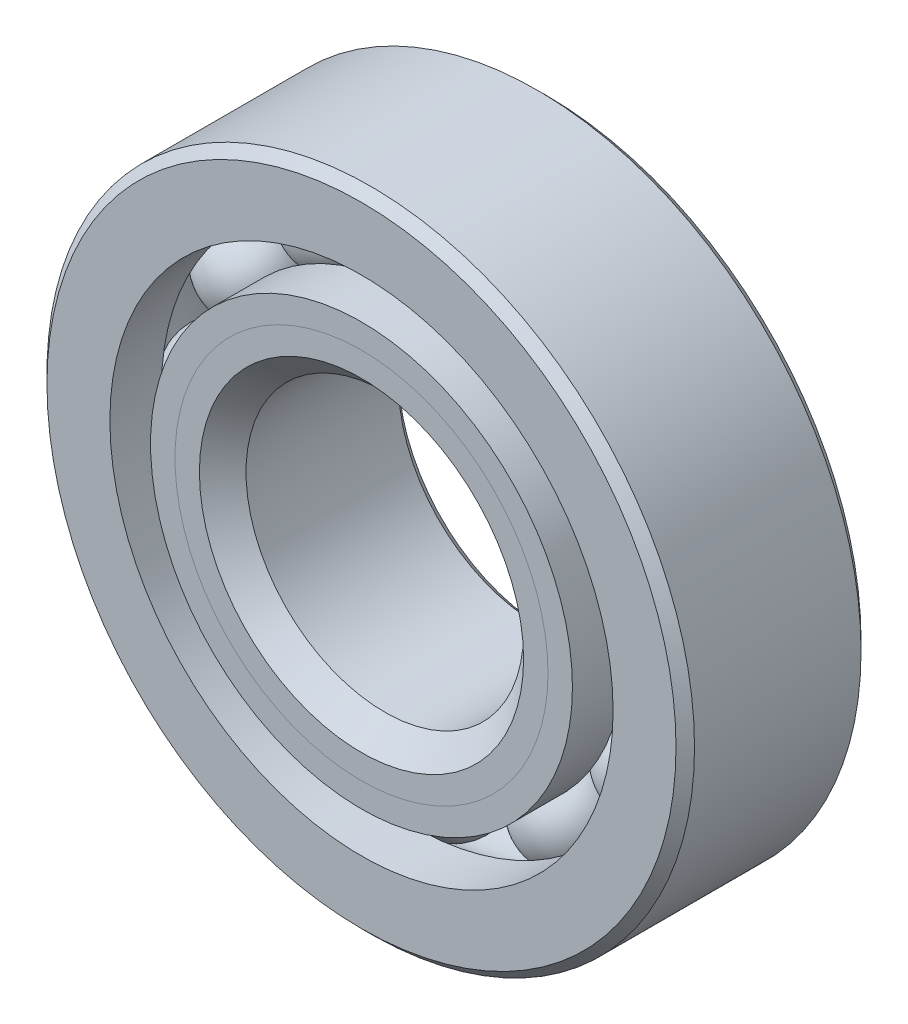
ISO-10303-21;
HEADER;
FILE_DESCRIPTION(('STEP AP214'),'2;1');
FILE_NAME('part.step','',(''),(''),'','','');
FILE_SCHEMA(('AUTOMOTIVE_DESIGN { 1 0 10303 214 1 1 1 1 }'));
ENDSEC;
DATA;
#1=APPLICATION_CONTEXT('core data for automotive mechanical design processes');
#2=APPLICATION_PROTOCOL_DEFINITION('international standard','automotive_design',2000,#1);
#3=PRODUCT_CONTEXT('',#1,'mechanical');
#4=PRODUCT('Part','Part','',(#3));
#5=PRODUCT_RELATED_PRODUCT_CATEGORY('part','',(#4));
#6=PRODUCT_DEFINITION_FORMATION('','',#4);
#7=PRODUCT_DEFINITION_CONTEXT('part definition',#1,'design');
#8=PRODUCT_DEFINITION('design','',#6,#7);
#9=PRODUCT_DEFINITION_SHAPE('','',#8);
#10=(LENGTH_UNIT() NAMED_UNIT(*) SI_UNIT(.MILLI.,.METRE.));
#11=(NAMED_UNIT(*) PLANE_ANGLE_UNIT() SI_UNIT($,.RADIAN.));
#12=(NAMED_UNIT(*) SI_UNIT($,.STERADIAN.) SOLID_ANGLE_UNIT());
#13=UNCERTAINTY_MEASURE_WITH_UNIT(LENGTH_MEASURE(1.E-05),#10,'distance_accuracy_value','');
#14=(GEOMETRIC_REPRESENTATION_CONTEXT(3) GLOBAL_UNCERTAINTY_ASSIGNED_CONTEXT((#13)) GLOBAL_UNIT_ASSIGNED_CONTEXT((#10,
#11,#12)) REPRESENTATION_CONTEXT('',''));
#15=CARTESIAN_POINT('',(0.,0.,0.));
#16=DIRECTION('',(0.,0.,1.));
#17=DIRECTION('',(1.,0.,0.));
#18=AXIS2_PLACEMENT_3D('',#15,#16,#17);
#19=CARTESIAN_POINT('',(-4.99999999999989,8.66025403784445,0.));
#20=DIRECTION('',(0.,0.,1.));
#21=DIRECTION('',(-0.499999999999989,0.866025403784445,0.));
#22=AXIS2_PLACEMENT_3D('',#19,#20,#21);
#23=SPHERICAL_SURFACE('',#22,1.9832668371318);
#24=CARTESIAN_POINT('',(-4.99999999999989,8.66025403784445,1.9832668371318));
#25=VERTEX_POINT('',#24);
#26=VERTEX_LOOP('',#25);
#27=FACE_BOUND('',#26,.T.);
#28=ADVANCED_FACE('F42',(#27),#23,.T.);
#29=CLOSED_SHELL('',(#28));
#30=MANIFOLD_SOLID_BREP('B2',#29);
#31=CARTESIAN_POINT('',(-8.66025403784433,5.0000000000001,0.));
#32=DIRECTION('',(0.,0.,1.));
#33=DIRECTION('',(-0.866025403784433,0.50000000000001,0.));
#34=AXIS2_PLACEMENT_3D('',#31,#32,#33);
#35=SPHERICAL_SURFACE('',#34,1.9832668371318);
#36=CARTESIAN_POINT('',(-8.66025403784433,5.0000000000001,1.9832668371318));
#37=VERTEX_POINT('',#36);
#38=VERTEX_LOOP('',#37);
#39=FACE_BOUND('',#38,.T.);
#40=ADVANCED_FACE('F75',(#39),#35,.T.);
#41=CLOSED_SHELL('',(#40));
#42=MANIFOLD_SOLID_BREP('B6',#41);
#43=CARTESIAN_POINT('',(-10.,1.04744440165294E-13,0.));
#44=DIRECTION('',(0.,0.,1.));
#45=DIRECTION('',(-1.,0.,0.));
#46=AXIS2_PLACEMENT_3D('',#43,#44,#45);
#47=SPHERICAL_SURFACE('',#46,1.9832668371318);
#48=CARTESIAN_POINT('',(-10.,1.04744440165294E-13,1.9832668371318));
#49=VERTEX_POINT('',#48);
#50=VERTEX_LOOP('',#49);
#51=FACE_BOUND('',#50,.T.);
#52=ADVANCED_FACE('F108',(#51),#47,.T.);
#53=CLOSED_SHELL('',(#52));
#54=MANIFOLD_SOLID_BREP('B38',#53);
#55=CARTESIAN_POINT('',(-8.66025403784443,-4.99999999999992,0.));
#56=DIRECTION('',(0.,0.,1.));
#57=DIRECTION('',(-0.866025403784443,-0.499999999999992,0.));
#58=AXIS2_PLACEMENT_3D('',#55,#56,#57);
#59=SPHERICAL_SURFACE('',#58,1.9832668371318);
#60=CARTESIAN_POINT('',(-8.66025403784443,-4.99999999999992,1.9832668371318));
#61=VERTEX_POINT('',#60);
#62=VERTEX_LOOP('',#61);
#63=FACE_BOUND('',#62,.T.);
#64=ADVANCED_FACE('F141',(#63),#59,.T.);
#65=CLOSED_SHELL('',(#64));
#66=MANIFOLD_SOLID_BREP('B71',#65);
#67=CARTESIAN_POINT('',(-5.00000000000007,-8.66025403784435,0.));
#68=DIRECTION('',(0.,0.,1.));
#69=DIRECTION('',(-0.500000000000007,-0.866025403784435,0.));
#70=AXIS2_PLACEMENT_3D('',#67,#68,#69);
#71=SPHERICAL_SURFACE('',#70,1.9832668371318);
#72=CARTESIAN_POINT('',(-5.00000000000007,-8.66025403784435,1.9832668371318));
#73=VERTEX_POINT('',#72);
#74=VERTEX_LOOP('',#73);
#75=FACE_BOUND('',#74,.T.);
#76=ADVANCED_FACE('F174',(#75),#71,.T.);
#77=CLOSED_SHELL('',(#76));
#78=MANIFOLD_SOLID_BREP('B104',#77);
#79=CARTESIAN_POINT('',(0.,-10.,0.));
#80=DIRECTION('',(0.,0.,1.));
#81=DIRECTION('',(0.,-1.,0.));
#82=AXIS2_PLACEMENT_3D('',#79,#80,#81);
#83=SPHERICAL_SURFACE('',#82,1.9832668371318);
#84=CARTESIAN_POINT('',(0.,-10.,1.9832668371318));
#85=VERTEX_POINT('',#84);
#86=VERTEX_LOOP('',#85);
#87=FACE_BOUND('',#86,.T.);
#88=ADVANCED_FACE('F207',(#87),#83,.T.);
#89=CLOSED_SHELL('',(#88));
#90=MANIFOLD_SOLID_BREP('B137',#89);
#91=CARTESIAN_POINT('',(4.99999999999995,-8.66025403784442,0.));
#92=DIRECTION('',(0.,0.,1.));
#93=DIRECTION('',(0.499999999999995,-0.866025403784442,0.));
#94=AXIS2_PLACEMENT_3D('',#91,#92,#93);
#95=SPHERICAL_SURFACE('',#94,1.9832668371318);
#96=CARTESIAN_POINT('',(4.99999999999995,-8.66025403784442,1.9832668371318));
#97=VERTEX_POINT('',#96);
#98=VERTEX_LOOP('',#97);
#99=FACE_BOUND('',#98,.T.);
#100=ADVANCED_FACE('F240',(#99),#95,.T.);
#101=CLOSED_SHELL('',(#100));
#102=MANIFOLD_SOLID_BREP('B170',#101);
#103=CARTESIAN_POINT('',(8.66025403784437,-5.00000000000004,0.));
#104=DIRECTION('',(0.,0.,1.));
#105=DIRECTION('',(0.866025403784436,-0.500000000000004,0.));
#106=AXIS2_PLACEMENT_3D('',#103,#104,#105);
#107=SPHERICAL_SURFACE('',#106,1.9832668371318);
#108=CARTESIAN_POINT('',(8.66025403784437,-5.00000000000004,1.9832668371318));
#109=VERTEX_POINT('',#108);
#110=VERTEX_LOOP('',#109);
#111=FACE_BOUND('',#110,.T.);
#112=ADVANCED_FACE('F275',(#111),#107,.T.);
#113=CLOSED_SHELL('',(#112));
#114=MANIFOLD_SOLID_BREP('B203',#113);
#115=CARTESIAN_POINT('',(10.,0.,0.));
#116=DIRECTION('',(0.,0.,1.));
#117=DIRECTION('',(1.,0.,0.));
#118=AXIS2_PLACEMENT_3D('',#115,#116,#117);
#119=SPHERICAL_SURFACE('',#118,1.9832668371318);
#120=CARTESIAN_POINT('',(10.,0.,1.9832668371318));
#121=VERTEX_POINT('',#120);
#122=VERTEX_LOOP('',#121);
#123=FACE_BOUND('',#122,.T.);
#124=ADVANCED_FACE('F310',(#123),#119,.T.);
#125=CLOSED_SHELL('',(#124));
#126=MANIFOLD_SOLID_BREP('B236',#125);
#127=CARTESIAN_POINT('',(8.6602540378444,4.99999999999998,0.));
#128=DIRECTION('',(0.,0.,1.));
#129=DIRECTION('',(0.86602540378444,0.499999999999998,0.));
#130=AXIS2_PLACEMENT_3D('',#127,#128,#129);
#131=SPHERICAL_SURFACE('',#130,1.9832668371318);
#132=CARTESIAN_POINT('',(8.6602540378444,4.99999999999998,1.9832668371318));
#133=VERTEX_POINT('',#132);
#134=VERTEX_LOOP('',#133);
#135=FACE_BOUND('',#134,.T.);
#136=ADVANCED_FACE('F345',(#135),#131,.T.);
#137=CLOSED_SHELL('',(#136));
#138=MANIFOLD_SOLID_BREP('B271',#137);
#139=CARTESIAN_POINT('',(5.00000000000001,8.66025403784438,0.));
#140=DIRECTION('',(0.,0.,1.));
#141=DIRECTION('',(0.500000000000001,0.866025403784438,0.));
#142=AXIS2_PLACEMENT_3D('',#139,#140,#141);
#143=SPHERICAL_SURFACE('',#142,1.9832668371318);
#144=CARTESIAN_POINT('',(5.00000000000001,8.66025403784438,1.9832668371318));
#145=VERTEX_POINT('',#144);
#146=VERTEX_LOOP('',#145);
#147=FACE_BOUND('',#146,.T.);
#148=ADVANCED_FACE('F378',(#147),#143,.T.);
#149=CLOSED_SHELL('',(#148));
#150=MANIFOLD_SOLID_BREP('B306',#149);
#151=CARTESIAN_POINT('',(0.,10.,0.));
#152=DIRECTION('',(0.,0.,1.));
#153=DIRECTION('',(0.,1.,0.));
#154=AXIS2_PLACEMENT_3D('',#151,#152,#153);
#155=SPHERICAL_SURFACE('',#154,1.9832668371318);
#156=CARTESIAN_POINT('',(0.,10.,1.9832668371318));
#157=VERTEX_POINT('',#156);
#158=VERTEX_LOOP('',#157);
#159=FACE_BOUND('',#158,.T.);
#160=ADVANCED_FACE('F415',(#159),#155,.T.);
#161=CLOSED_SHELL('',(#160));
#162=MANIFOLD_SOLID_BREP('B341',#161);
#163=CARTESIAN_POINT('',(0.,8.06462285115661,4.));
#164=DIRECTION('',(0.,0.,-1.));
#165=DIRECTION('',(-1.,0.,0.));
#166=AXIS2_PLACEMENT_3D('',#163,#164,#165);
#167=PLANE('',#166);
#168=CARTESIAN_POINT('',(0.,0.,4.));
#169=DIRECTION('',(0.,0.,1.));
#170=DIRECTION('',(1.,0.,0.));
#171=AXIS2_PLACEMENT_3D('',#168,#169,#170);
#172=CIRCLE('',#171,7.0083665814341);
#173=CARTESIAN_POINT('',(7.0083665814341,0.,4.));
#174=VERTEX_POINT('',#173);
#175=EDGE_CURVE('E468',#174,#174,#172,.T.);
#176=ORIENTED_EDGE('',*,*,#175,.F.);
#177=EDGE_LOOP('',(#176));
#178=FACE_BOUND('',#177,.T.);
#179=CARTESIAN_POINT('',(0.,0.,4.));
#180=DIRECTION('',(0.,0.,1.));
#181=DIRECTION('',(1.,0.,0.));
#182=AXIS2_PLACEMENT_3D('',#179,#180,#181);
#183=CIRCLE('',#182,8.06462285115661);
#184=CARTESIAN_POINT('',(8.06462285115661,0.,4.));
#185=VERTEX_POINT('',#184);
#186=EDGE_CURVE('E414',#185,#185,#183,.T.);
#187=ORIENTED_EDGE('',*,*,#186,.T.);
#188=EDGE_LOOP('',(#187));
#189=FACE_BOUND('',#188,.T.);
#190=ADVANCED_FACE('F434',(#178,#189),#167,.F.);
#191=CARTESIAN_POINT('',(0.,0.,2.94374373027749));
#192=DIRECTION('',(0.,0.,1.));
#193=DIRECTION('',(1.,0.,0.));
#194=AXIS2_PLACEMENT_3D('',#191,#192,#193);
#195=CONICAL_SURFACE('',#194,7.0083665814341,0.78539816339745);
#196=ORIENTED_EDGE('',*,*,#186,.F.);
#197=EDGE_LOOP('',(#196));
#198=FACE_BOUND('',#197,.T.);
#199=CARTESIAN_POINT('',(0.,0.,2.94374373027749));
#200=DIRECTION('',(0.,0.,1.));
#201=DIRECTION('',(1.,0.,0.));
#202=AXIS2_PLACEMENT_3D('',#199,#200,#201);
#203=CIRCLE('',#202,7.0083665814341);
#204=CARTESIAN_POINT('',(7.0083665814341,0.,2.94374373027749));
#205=VERTEX_POINT('',#204);
#206=EDGE_CURVE('E440',#205,#205,#203,.T.);
#207=ORIENTED_EDGE('',*,*,#206,.T.);
#208=EDGE_LOOP('',(#207));
#209=FACE_BOUND('',#208,.T.);
#210=ADVANCED_FACE('F475',(#198,#209),#195,.T.);
#211=CARTESIAN_POINT('',(0.,0.,4.));
#212=DIRECTION('',(0.,0.,1.));
#213=DIRECTION('',(1.,0.,0.));
#214=AXIS2_PLACEMENT_3D('',#211,#212,#213);
#215=CYLINDRICAL_SURFACE('',#214,7.0083665814341);
#216=ORIENTED_EDGE('',*,*,#206,.F.);
#217=EDGE_LOOP('',(#216));
#218=FACE_BOUND('',#217,.T.);
#219=CARTESIAN_POINT('',(0.,0.,0.));
#220=DIRECTION('',(0.,0.,1.));
#221=DIRECTION('',(1.,0.,0.));
#222=AXIS2_PLACEMENT_3D('',#219,#220,#221);
#223=CIRCLE('',#222,7.0083665814341);
#224=CARTESIAN_POINT('',(7.0083665814341,0.,0.));
#225=VERTEX_POINT('',#224);
#226=EDGE_CURVE('E444',#225,#225,#223,.T.);
#227=ORIENTED_EDGE('',*,*,#226,.T.);
#228=EDGE_LOOP('',(#227));
#229=FACE_BOUND('',#228,.T.);
#230=ADVANCED_FACE('F479',(#218,#229),#215,.T.);
#231=CARTESIAN_POINT('',(0.,7.0083665814341,0.));
#232=DIRECTION('',(0.,0.,-1.));
#233=DIRECTION('',(-1.,0.,0.));
#234=AXIS2_PLACEMENT_3D('',#231,#232,#233);
#235=PLANE('',#234);
#236=ORIENTED_EDGE('',*,*,#226,.F.);
#237=EDGE_LOOP('',(#236));
#238=FACE_BOUND('',#237,.T.);
#239=CARTESIAN_POINT('',(0.,0.,0.));
#240=DIRECTION('',(0.,0.,1.));
#241=DIRECTION('',(1.,0.,0.));
#242=AXIS2_PLACEMENT_3D('',#239,#240,#241);
#243=CIRCLE('',#242,8.0167331628682);
#244=CARTESIAN_POINT('',(8.0167331628682,0.,0.));
#245=VERTEX_POINT('',#244);
#246=EDGE_CURVE('E448',#245,#245,#243,.T.);
#247=ORIENTED_EDGE('',*,*,#246,.T.);
#248=EDGE_LOOP('',(#247));
#249=FACE_BOUND('',#248,.T.);
#250=ADVANCED_FACE('F484',(#238,#249),#235,.F.);
#251=CARTESIAN_POINT('',(0.,0.,0.));
#252=DIRECTION('',(0.,0.,1.));
#253=DIRECTION('',(1.,0.,0.));
#254=AXIS2_PLACEMENT_3D('',#251,#252,#253);
#255=TOROIDAL_SURFACE('',#254,10.,1.9832668371318);
#256=ORIENTED_EDGE('',*,*,#246,.F.);
#257=EDGE_LOOP('',(#256));
#258=FACE_BOUND('',#257,.T.);
#259=CARTESIAN_POINT('',(0.,0.,-1.77777777777778));
#260=DIRECTION('',(0.,0.,1.));
#261=DIRECTION('',(1.,0.,0.));
#262=AXIS2_PLACEMENT_3D('',#259,#260,#261);
#263=CIRCLE('',#262,9.12087912087912);
#264=CARTESIAN_POINT('',(9.12087912087912,0.,-1.77777777777778));
#265=VERTEX_POINT('',#264);
#266=EDGE_CURVE('E453',#265,#265,#263,.T.);
#267=ORIENTED_EDGE('',*,*,#266,.T.);
#268=EDGE_LOOP('',(#267));
#269=FACE_BOUND('',#268,.T.);
#270=ADVANCED_FACE('F490',(#258,#269),#255,.F.);
#271=CARTESIAN_POINT('',(0.,0.,4.));
#272=DIRECTION('',(0.,0.,1.));
#273=DIRECTION('',(1.,0.,0.));
#274=AXIS2_PLACEMENT_3D('',#271,#272,#273);
#275=CYLINDRICAL_SURFACE('',#274,9.12087912087912);
#276=ORIENTED_EDGE('',*,*,#266,.F.);
#277=EDGE_LOOP('',(#276));
#278=FACE_BOUND('',#277,.T.);
#279=CARTESIAN_POINT('',(0.,0.,-4.));
#280=DIRECTION('',(0.,0.,1.));
#281=DIRECTION('',(1.,0.,0.));
#282=AXIS2_PLACEMENT_3D('',#279,#280,#281);
#283=CIRCLE('',#282,9.12087912087912);
#284=CARTESIAN_POINT('',(9.12087912087912,0.,-4.));
#285=VERTEX_POINT('',#284);
#286=EDGE_CURVE('E456',#285,#285,#283,.T.);
#287=ORIENTED_EDGE('',*,*,#286,.T.);
#288=EDGE_LOOP('',(#287));
#289=FACE_BOUND('',#288,.T.);
#290=ADVANCED_FACE('F494',(#278,#289),#275,.T.);
#291=CARTESIAN_POINT('',(0.,6.4,-4.));
#292=DIRECTION('',(0.,0.,1.));
#293=DIRECTION('',(1.,0.,0.));
#294=AXIS2_PLACEMENT_3D('',#291,#292,#293);
#295=PLANE('',#294);
#296=ORIENTED_EDGE('',*,*,#286,.F.);
#297=EDGE_LOOP('',(#296));
#298=FACE_BOUND('',#297,.T.);
#299=CARTESIAN_POINT('',(0.,0.,-4.));
#300=DIRECTION('',(0.,0.,1.));
#301=DIRECTION('',(1.,0.,0.));
#302=AXIS2_PLACEMENT_3D('',#299,#300,#301);
#303=CIRCLE('',#302,6.4);
#304=CARTESIAN_POINT('',(6.4,0.,-4.));
#305=VERTEX_POINT('',#304);
#306=EDGE_CURVE('E459',#305,#305,#303,.T.);
#307=ORIENTED_EDGE('',*,*,#306,.T.);
#308=EDGE_LOOP('',(#307));
#309=FACE_BOUND('',#308,.T.);
#310=ADVANCED_FACE('F498',(#298,#309),#295,.F.);
#311=CARTESIAN_POINT('',(0.,0.,-3.6));
#312=DIRECTION('',(0.,0.,-1.));
#313=DIRECTION('',(-1.,0.,0.));
#314=AXIS2_PLACEMENT_3D('',#311,#312,#313);
#315=CONICAL_SURFACE('',#314,6.,0.785398163397448);
#316=ORIENTED_EDGE('',*,*,#306,.F.);
#317=EDGE_LOOP('',(#316));
#318=FACE_BOUND('',#317,.T.);
#319=CARTESIAN_POINT('',(0.,0.,-3.6));
#320=DIRECTION('',(0.,0.,1.));
#321=DIRECTION('',(1.,0.,0.));
#322=AXIS2_PLACEMENT_3D('',#319,#320,#321);
#323=CIRCLE('',#322,6.);
#324=CARTESIAN_POINT('',(6.,0.,-3.6));
#325=VERTEX_POINT('',#324);
#326=EDGE_CURVE('E462',#325,#325,#323,.T.);
#327=ORIENTED_EDGE('',*,*,#326,.T.);
#328=EDGE_LOOP('',(#327));
#329=FACE_BOUND('',#328,.T.);
#330=ADVANCED_FACE('F502',(#318,#329),#315,.F.);
#331=CARTESIAN_POINT('',(0.,0.,4.));
#332=DIRECTION('',(0.,0.,1.));
#333=DIRECTION('',(1.,0.,0.));
#334=AXIS2_PLACEMENT_3D('',#331,#332,#333);
#335=CYLINDRICAL_SURFACE('',#334,6.);
#336=ORIENTED_EDGE('',*,*,#326,.F.);
#337=EDGE_LOOP('',(#336));
#338=FACE_BOUND('',#337,.T.);
#339=CARTESIAN_POINT('',(0.,0.,2.9916334185659));
#340=DIRECTION('',(0.,0.,1.));
#341=DIRECTION('',(1.,0.,0.));
#342=AXIS2_PLACEMENT_3D('',#339,#340,#341);
#343=CIRCLE('',#342,6.);
#344=CARTESIAN_POINT('',(6.,0.,2.9916334185659));
#345=VERTEX_POINT('',#344);
#346=EDGE_CURVE('E465',#345,#345,#343,.T.);
#347=ORIENTED_EDGE('',*,*,#346,.T.);
#348=EDGE_LOOP('',(#347));
#349=FACE_BOUND('',#348,.T.);
#350=ADVANCED_FACE('F506',(#338,#349),#335,.F.);
#351=CARTESIAN_POINT('',(0.,0.,4.));
#352=DIRECTION('',(0.,0.,1.));
#353=DIRECTION('',(1.,0.,0.));
#354=AXIS2_PLACEMENT_3D('',#351,#352,#353);
#355=CONICAL_SURFACE('',#354,7.0083665814341,0.785398163397449);
#356=ORIENTED_EDGE('',*,*,#346,.F.);
#357=EDGE_LOOP('',(#356));
#358=FACE_BOUND('',#357,.T.);
#359=ORIENTED_EDGE('',*,*,#175,.T.);
#360=EDGE_LOOP('',(#359));
#361=FACE_BOUND('',#360,.T.);
#362=ADVANCED_FACE('F472',(#358,#361),#355,.F.);
#363=CLOSED_SHELL('',(#190,#210,#230,#250,#270,#290,#310,#330,#350,#362));
#364=MANIFOLD_SOLID_BREP('B374',#363);
#365=CARTESIAN_POINT('',(0.,9.12087912087912,4.));
#366=DIRECTION('',(0.,0.,-1.));
#367=DIRECTION('',(-1.,0.,0.));
#368=AXIS2_PLACEMENT_3D('',#365,#366,#367);
#369=PLANE('',#368);
#370=CARTESIAN_POINT('',(0.,0.,4.));
#371=DIRECTION('',(0.,0.,1.));
#372=DIRECTION('',(1.,0.,0.));
#373=AXIS2_PLACEMENT_3D('',#370,#371,#372);
#374=CIRCLE('',#373,8.06462285115661);
#375=CARTESIAN_POINT('',(8.06462285115661,0.,4.));
#376=VERTEX_POINT('',#375);
#377=EDGE_CURVE('E433',#376,#376,#374,.T.);
#378=ORIENTED_EDGE('',*,*,#377,.F.);
#379=EDGE_LOOP('',(#378));
#380=FACE_BOUND('',#379,.T.);
#381=CARTESIAN_POINT('',(0.,0.,4.));
#382=DIRECTION('',(0.,0.,1.));
#383=DIRECTION('',(1.,0.,0.));
#384=AXIS2_PLACEMENT_3D('',#381,#382,#383);
#385=CIRCLE('',#384,9.12087912087912);
#386=CARTESIAN_POINT('',(9.12087912087912,0.,4.));
#387=VERTEX_POINT('',#386);
#388=EDGE_CURVE('E595',#387,#387,#385,.T.);
#389=ORIENTED_EDGE('',*,*,#388,.T.);
#390=EDGE_LOOP('',(#389));
#391=FACE_BOUND('',#390,.T.);
#392=ADVANCED_FACE('F573',(#380,#391),#369,.F.);
#393=CARTESIAN_POINT('',(0.,0.,4.));
#394=DIRECTION('',(0.,0.,1.));
#395=DIRECTION('',(1.,0.,0.));
#396=AXIS2_PLACEMENT_3D('',#393,#394,#395);
#397=CONICAL_SURFACE('',#396,8.06462285115661,0.78539816339745);
#398=CARTESIAN_POINT('',(0.,0.,2.94374373027749));
#399=DIRECTION('',(0.,0.,1.));
#400=DIRECTION('',(1.,0.,0.));
#401=AXIS2_PLACEMENT_3D('',#398,#399,#400);
#402=CIRCLE('',#401,7.0083665814341);
#403=CARTESIAN_POINT('',(7.0083665814341,0.,2.94374373027749));
#404=VERTEX_POINT('',#403);
#405=EDGE_CURVE('E579',#404,#404,#402,.T.);
#406=ORIENTED_EDGE('',*,*,#405,.F.);
#407=EDGE_LOOP('',(#406));
#408=FACE_BOUND('',#407,.T.);
#409=ORIENTED_EDGE('',*,*,#377,.T.);
#410=EDGE_LOOP('',(#409));
#411=FACE_BOUND('',#410,.T.);
#412=ADVANCED_FACE('F620',(#408,#411),#397,.F.);
#413=CARTESIAN_POINT('',(0.,0.,4.));
#414=DIRECTION('',(0.,0.,1.));
#415=DIRECTION('',(1.,0.,0.));
#416=AXIS2_PLACEMENT_3D('',#413,#414,#415);
#417=CYLINDRICAL_SURFACE('',#416,7.0083665814341);
#418=CARTESIAN_POINT('',(0.,0.,0.));
#419=DIRECTION('',(0.,0.,1.));
#420=DIRECTION('',(1.,0.,0.));
#421=AXIS2_PLACEMENT_3D('',#418,#419,#420);
#422=CIRCLE('',#421,7.0083665814341);
#423=CARTESIAN_POINT('',(7.0083665814341,0.,0.));
#424=VERTEX_POINT('',#423);
#425=EDGE_CURVE('E583',#424,#424,#422,.T.);
#426=ORIENTED_EDGE('',*,*,#425,.F.);
#427=EDGE_LOOP('',(#426));
#428=FACE_BOUND('',#427,.T.);
#429=ORIENTED_EDGE('',*,*,#405,.T.);
#430=EDGE_LOOP('',(#429));
#431=FACE_BOUND('',#430,.T.);
#432=ADVANCED_FACE('F615',(#428,#431),#417,.F.);
#433=CARTESIAN_POINT('',(0.,7.0083665814341,0.));
#434=DIRECTION('',(0.,0.,1.));
#435=DIRECTION('',(1.,0.,0.));
#436=AXIS2_PLACEMENT_3D('',#433,#434,#435);
#437=PLANE('',#436);
#438=CARTESIAN_POINT('',(0.,0.,0.));
#439=DIRECTION('',(0.,0.,1.));
#440=DIRECTION('',(1.,0.,0.));
#441=AXIS2_PLACEMENT_3D('',#438,#439,#440);
#442=CIRCLE('',#441,8.0167331628682);
#443=CARTESIAN_POINT('',(8.0167331628682,0.,0.));
#444=VERTEX_POINT('',#443);
#445=EDGE_CURVE('E587',#444,#444,#442,.T.);
#446=ORIENTED_EDGE('',*,*,#445,.F.);
#447=EDGE_LOOP('',(#446));
#448=FACE_BOUND('',#447,.T.);
#449=ORIENTED_EDGE('',*,*,#425,.T.);
#450=EDGE_LOOP('',(#449));
#451=FACE_BOUND('',#450,.T.);
#452=ADVANCED_FACE('F609',(#448,#451),#437,.F.);
#453=CARTESIAN_POINT('',(0.,0.,0.));
#454=DIRECTION('',(0.,0.,1.));
#455=DIRECTION('',(1.,0.,0.));
#456=AXIS2_PLACEMENT_3D('',#453,#454,#455);
#457=TOROIDAL_SURFACE('',#456,10.,1.9832668371318);
#458=CARTESIAN_POINT('',(0.,0.,1.77777777777778));
#459=DIRECTION('',(0.,0.,1.));
#460=DIRECTION('',(1.,0.,0.));
#461=AXIS2_PLACEMENT_3D('',#458,#459,#460);
#462=CIRCLE('',#461,9.12087912087912);
#463=CARTESIAN_POINT('',(9.12087912087912,0.,1.77777777777778));
#464=VERTEX_POINT('',#463);
#465=EDGE_CURVE('E592',#464,#464,#462,.T.);
#466=ORIENTED_EDGE('',*,*,#465,.F.);
#467=EDGE_LOOP('',(#466));
#468=FACE_BOUND('',#467,.T.);
#469=ORIENTED_EDGE('',*,*,#445,.T.);
#470=EDGE_LOOP('',(#469));
#471=FACE_BOUND('',#470,.T.);
#472=ADVANCED_FACE('F603',(#468,#471),#457,.F.);
#473=CARTESIAN_POINT('',(0.,0.,4.));
#474=DIRECTION('',(0.,0.,1.));
#475=DIRECTION('',(1.,0.,0.));
#476=AXIS2_PLACEMENT_3D('',#473,#474,#475);
#477=CYLINDRICAL_SURFACE('',#476,9.12087912087912);
#478=ORIENTED_EDGE('',*,*,#388,.F.);
#479=EDGE_LOOP('',(#478));
#480=FACE_BOUND('',#479,.T.);
#481=ORIENTED_EDGE('',*,*,#465,.T.);
#482=EDGE_LOOP('',(#481));
#483=FACE_BOUND('',#482,.T.);
#484=ADVANCED_FACE('F600',(#480,#483),#477,.T.);
#485=CLOSED_SHELL('',(#392,#412,#432,#452,#472,#484));
#486=MANIFOLD_SOLID_BREP('B409',#485);
#487=CARTESIAN_POINT('',(0.,0.,3.6));
#488=DIRECTION('',(0.,0.,-1.));
#489=DIRECTION('',(-1.,0.,0.));
#490=AXIS2_PLACEMENT_3D('',#487,#488,#489);
#491=CONICAL_SURFACE('',#490,14.,0.785398163397447);
#492=CARTESIAN_POINT('',(0.,0.,4.));
#493=DIRECTION('',(0.,0.,1.));
#494=DIRECTION('',(1.,0.,0.));
#495=AXIS2_PLACEMENT_3D('',#492,#493,#494);
#496=CIRCLE('',#495,13.6);
#497=CARTESIAN_POINT('',(13.6,0.,4.));
#498=VERTEX_POINT('',#497);
#499=EDGE_CURVE('E681',#498,#498,#496,.T.);
#500=ORIENTED_EDGE('',*,*,#499,.F.);
#501=EDGE_LOOP('',(#500));
#502=FACE_BOUND('',#501,.T.);
#503=CARTESIAN_POINT('',(0.,0.,3.6));
#504=DIRECTION('',(0.,0.,1.));
#505=DIRECTION('',(1.,0.,0.));
#506=AXIS2_PLACEMENT_3D('',#503,#504,#505);
#507=CIRCLE('',#506,14.);
#508=CARTESIAN_POINT('',(14.,0.,3.6));
#509=VERTEX_POINT('',#508);
#510=EDGE_CURVE('E572',#509,#509,#507,.T.);
#511=ORIENTED_EDGE('',*,*,#510,.T.);
#512=EDGE_LOOP('',(#511));
#513=FACE_BOUND('',#512,.T.);
#514=ADVANCED_FACE('F653',(#502,#513),#491,.T.);
#515=CARTESIAN_POINT('',(0.,0.,4.));
#516=DIRECTION('',(0.,0.,1.));
#517=DIRECTION('',(1.,0.,0.));
#518=AXIS2_PLACEMENT_3D('',#515,#516,#517);
#519=CYLINDRICAL_SURFACE('',#518,14.);
#520=ORIENTED_EDGE('',*,*,#510,.F.);
#521=EDGE_LOOP('',(#520));
#522=FACE_BOUND('',#521,.T.);
#523=CARTESIAN_POINT('',(0.,0.,-3.6));
#524=DIRECTION('',(0.,0.,1.));
#525=DIRECTION('',(1.,0.,0.));
#526=AXIS2_PLACEMENT_3D('',#523,#524,#525);
#527=CIRCLE('',#526,14.);
#528=CARTESIAN_POINT('',(14.,0.,-3.6));
#529=VERTEX_POINT('',#528);
#530=EDGE_CURVE('E659',#529,#529,#527,.T.);
#531=ORIENTED_EDGE('',*,*,#530,.T.);
#532=EDGE_LOOP('',(#531));
#533=FACE_BOUND('',#532,.T.);
#534=ADVANCED_FACE('F688',(#522,#533),#519,.T.);
#535=CARTESIAN_POINT('',(0.,0.,-4.));
#536=DIRECTION('',(0.,0.,1.));
#537=DIRECTION('',(1.,0.,0.));
#538=AXIS2_PLACEMENT_3D('',#535,#536,#537);
#539=CONICAL_SURFACE('',#538,13.6,0.785398163397448);
#540=ORIENTED_EDGE('',*,*,#530,.F.);
#541=EDGE_LOOP('',(#540));
#542=FACE_BOUND('',#541,.T.);
#543=CARTESIAN_POINT('',(0.,0.,-4.));
#544=DIRECTION('',(0.,0.,1.));
#545=DIRECTION('',(1.,0.,0.));
#546=AXIS2_PLACEMENT_3D('',#543,#544,#545);
#547=CIRCLE('',#546,13.6);
#548=CARTESIAN_POINT('',(13.6,0.,-4.));
#549=VERTEX_POINT('',#548);
#550=EDGE_CURVE('E663',#549,#549,#547,.T.);
#551=ORIENTED_EDGE('',*,*,#550,.T.);
#552=EDGE_LOOP('',(#551));
#553=FACE_BOUND('',#552,.T.);
#554=ADVANCED_FACE('F692',(#542,#553),#539,.T.);
#555=CARTESIAN_POINT('',(0.,13.6,-4.));
#556=DIRECTION('',(0.,0.,1.));
#557=DIRECTION('',(1.,0.,0.));
#558=AXIS2_PLACEMENT_3D('',#555,#556,#557);
#559=PLANE('',#558);
#560=ORIENTED_EDGE('',*,*,#550,.F.);
#561=EDGE_LOOP('',(#560));
#562=FACE_BOUND('',#561,.T.);
#563=CARTESIAN_POINT('',(0.,0.,-4.));
#564=DIRECTION('',(0.,0.,1.));
#565=DIRECTION('',(1.,0.,0.));
#566=AXIS2_PLACEMENT_3D('',#563,#564,#565);
#567=CIRCLE('',#566,10.8791208791209);
#568=CARTESIAN_POINT('',(10.8791208791209,0.,-4.));
#569=VERTEX_POINT('',#568);
#570=EDGE_CURVE('E667',#569,#569,#567,.T.);
#571=ORIENTED_EDGE('',*,*,#570,.T.);
#572=EDGE_LOOP('',(#571));
#573=FACE_BOUND('',#572,.T.);
#574=ADVANCED_FACE('F697',(#562,#573),#559,.F.);
#575=CARTESIAN_POINT('',(0.,0.,4.));
#576=DIRECTION('',(0.,0.,1.));
#577=DIRECTION('',(1.,0.,0.));
#578=AXIS2_PLACEMENT_3D('',#575,#576,#577);
#579=CYLINDRICAL_SURFACE('',#578,10.8791208791209);
#580=ORIENTED_EDGE('',*,*,#570,.F.);
#581=EDGE_LOOP('',(#580));
#582=FACE_BOUND('',#581,.T.);
#583=CARTESIAN_POINT('',(0.,0.,-1.77777777777778));
#584=DIRECTION('',(0.,0.,1.));
#585=DIRECTION('',(1.,0.,0.));
#586=AXIS2_PLACEMENT_3D('',#583,#584,#585);
#587=CIRCLE('',#586,10.8791208791209);
#588=CARTESIAN_POINT('',(10.8791208791209,0.,-1.77777777777778));
#589=VERTEX_POINT('',#588);
#590=EDGE_CURVE('E672',#589,#589,#587,.T.);
#591=ORIENTED_EDGE('',*,*,#590,.T.);
#592=EDGE_LOOP('',(#591));
#593=FACE_BOUND('',#592,.T.);
#594=ADVANCED_FACE('F703',(#582,#593),#579,.F.);
#595=CARTESIAN_POINT('',(0.,0.,0.));
#596=DIRECTION('',(0.,0.,1.));
#597=DIRECTION('',(1.,0.,0.));
#598=AXIS2_PLACEMENT_3D('',#595,#596,#597);
#599=TOROIDAL_SURFACE('',#598,10.,1.9832668371318);
#600=ORIENTED_EDGE('',*,*,#590,.F.);
#601=EDGE_LOOP('',(#600));
#602=FACE_BOUND('',#601,.T.);
#603=CARTESIAN_POINT('',(0.,0.,1.77777777777778));
#604=DIRECTION('',(0.,0.,1.));
#605=DIRECTION('',(1.,0.,0.));
#606=AXIS2_PLACEMENT_3D('',#603,#604,#605);
#607=CIRCLE('',#606,10.8791208791209);
#608=CARTESIAN_POINT('',(10.8791208791209,0.,1.77777777777778));
#609=VERTEX_POINT('',#608);
#610=EDGE_CURVE('E675',#609,#609,#607,.T.);
#611=ORIENTED_EDGE('',*,*,#610,.T.);
#612=EDGE_LOOP('',(#611));
#613=FACE_BOUND('',#612,.T.);
#614=ADVANCED_FACE('F707',(#602,#613),#599,.F.);
#615=CARTESIAN_POINT('',(0.,0.,4.));
#616=DIRECTION('',(0.,0.,1.));
#617=DIRECTION('',(1.,0.,0.));
#618=AXIS2_PLACEMENT_3D('',#615,#616,#617);
#619=CYLINDRICAL_SURFACE('',#618,10.8791208791209);
#620=ORIENTED_EDGE('',*,*,#610,.F.);
#621=EDGE_LOOP('',(#620));
#622=FACE_BOUND('',#621,.T.);
#623=CARTESIAN_POINT('',(0.,0.,4.));
#624=DIRECTION('',(0.,0.,1.));
#625=DIRECTION('',(1.,0.,0.));
#626=AXIS2_PLACEMENT_3D('',#623,#624,#625);
#627=CIRCLE('',#626,10.8791208791209);
#628=CARTESIAN_POINT('',(10.8791208791209,0.,4.));
#629=VERTEX_POINT('',#628);
#630=EDGE_CURVE('E678',#629,#629,#627,.T.);
#631=ORIENTED_EDGE('',*,*,#630,.T.);
#632=EDGE_LOOP('',(#631));
#633=FACE_BOUND('',#632,.T.);
#634=ADVANCED_FACE('F711',(#622,#633),#619,.F.);
#635=CARTESIAN_POINT('',(0.,13.6,4.));
#636=DIRECTION('',(0.,0.,-1.));
#637=DIRECTION('',(-1.,0.,0.));
#638=AXIS2_PLACEMENT_3D('',#635,#636,#637);
#639=PLANE('',#638);
#640=ORIENTED_EDGE('',*,*,#630,.F.);
#641=EDGE_LOOP('',(#640));
#642=FACE_BOUND('',#641,.T.);
#643=ORIENTED_EDGE('',*,*,#499,.T.);
#644=EDGE_LOOP('',(#643));
#645=FACE_BOUND('',#644,.T.);
#646=ADVANCED_FACE('F685',(#642,#645),#639,.F.);
#647=CLOSED_SHELL('',(#514,#534,#554,#574,#594,#614,#634,#646));
#648=MANIFOLD_SOLID_BREP('B428',#647);
#649=ADVANCED_BREP_SHAPE_REPRESENTATION('',(#18,#30,#42,#54,#66,#78,#90,#102,#114,#126,#138,
#150,#162,#364,#486,#648),#14);
#650=SHAPE_DEFINITION_REPRESENTATION(#9,#649);
ENDSEC;
END-ISO-10303-21;
